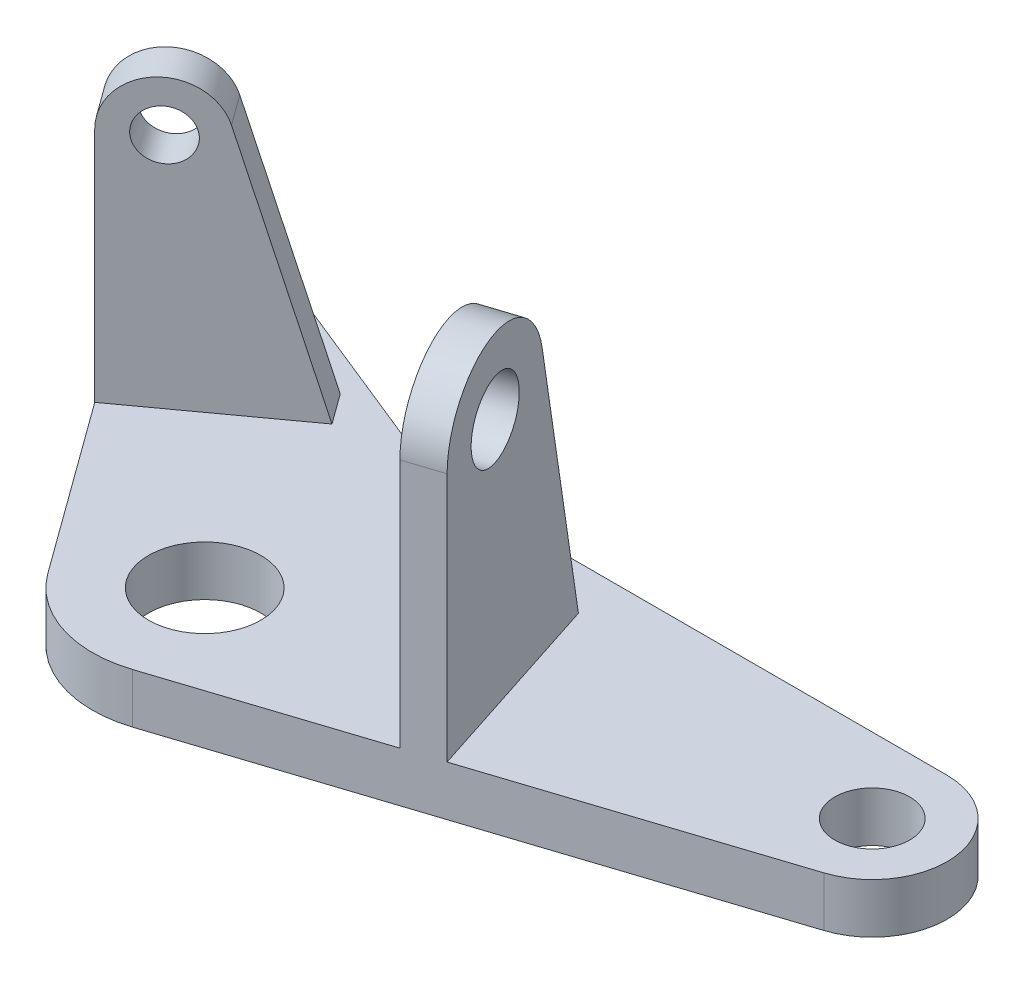
ISO-10303-21;
HEADER;
FILE_DESCRIPTION(('STEP AP214'),'2;1');
FILE_NAME('part.step','',(''),(''),'','','');
FILE_SCHEMA(('AUTOMOTIVE_DESIGN { 1 0 10303 214 1 1 1 1 }'));
ENDSEC;
DATA;
#1=APPLICATION_CONTEXT('core data for automotive mechanical design processes');
#2=APPLICATION_PROTOCOL_DEFINITION('international standard','automotive_design',2000,#1);
#3=PRODUCT_CONTEXT('',#1,'mechanical');
#4=PRODUCT('Part','Part','',(#3));
#5=PRODUCT_RELATED_PRODUCT_CATEGORY('part','',(#4));
#6=PRODUCT_DEFINITION_FORMATION('','',#4);
#7=PRODUCT_DEFINITION_CONTEXT('part definition',#1,'design');
#8=PRODUCT_DEFINITION('design','',#6,#7);
#9=PRODUCT_DEFINITION_SHAPE('','',#8);
#10=(LENGTH_UNIT() NAMED_UNIT(*) SI_UNIT(.MILLI.,.METRE.));
#11=(NAMED_UNIT(*) PLANE_ANGLE_UNIT() SI_UNIT($,.RADIAN.));
#12=(NAMED_UNIT(*) SI_UNIT($,.STERADIAN.) SOLID_ANGLE_UNIT());
#13=UNCERTAINTY_MEASURE_WITH_UNIT(LENGTH_MEASURE(1.E-05),#10,'distance_accuracy_value','');
#14=(GEOMETRIC_REPRESENTATION_CONTEXT(3) GLOBAL_UNCERTAINTY_ASSIGNED_CONTEXT((#13)) GLOBAL_UNIT_ASSIGNED_CONTEXT((#10,
#11,#12)) REPRESENTATION_CONTEXT('',''));
#15=CARTESIAN_POINT('',(0.,0.,0.));
#16=DIRECTION('',(0.,0.,1.));
#17=DIRECTION('',(1.,0.,0.));
#18=AXIS2_PLACEMENT_3D('',#15,#16,#17);
#19=CARTESIAN_POINT('',(82.,8.,12.));
#20=DIRECTION('',(0.,1.,0.));
#21=DIRECTION('',(0.,0.,1.));
#22=AXIS2_PLACEMENT_3D('',#19,#20,#21);
#23=PLANE('',#22);
#24=CARTESIAN_POINT('',(82.,8.,12.));
#25=DIRECTION('',(0.,1.,0.));
#26=DIRECTION('',(0.,0.,1.));
#27=AXIS2_PLACEMENT_3D('',#24,#25,#26);
#28=CIRCLE('',#27,6.);
#29=CARTESIAN_POINT('',(82.,8.,18.));
#30=VERTEX_POINT('',#29);
#31=EDGE_CURVE('E227',#30,#30,#28,.T.);
#32=ORIENTED_EDGE('',*,*,#31,.F.);
#33=EDGE_LOOP('',(#32));
#34=FACE_BOUND('',#33,.T.);
#35=CARTESIAN_POINT('',(-48.,8.,-10.7649808986669));
#36=DIRECTION('',(0.,1.,0.));
#37=DIRECTION('',(0.,0.,1.));
#38=AXIS2_PLACEMENT_3D('',#35,#36,#37);
#39=CIRCLE('',#38,4.00000000000001);
#40=CARTESIAN_POINT('',(-48.,8.,-6.76498089866689));
#41=VERTEX_POINT('',#40);
#42=EDGE_CURVE('E233',#41,#41,#39,.T.);
#43=ORIENTED_EDGE('',*,*,#42,.F.);
#44=EDGE_LOOP('',(#43));
#45=FACE_BOUND('',#44,.T.);
#46=CARTESIAN_POINT('',(-3.49949316028627,8.,33.4716960002775));
#47=DIRECTION('',(0.,1.,0.));
#48=DIRECTION('',(0.,0.,1.));
#49=AXIS2_PLACEMENT_3D('',#46,#47,#48);
#50=CIRCLE('',#49,9.);
#51=CARTESIAN_POINT('',(-3.49949316028627,8.,42.4716960002775));
#52=VERTEX_POINT('',#51);
#53=EDGE_CURVE('E221',#52,#52,#50,.T.);
#54=ORIENTED_EDGE('',*,*,#53,.F.);
#55=EDGE_LOOP('',(#54));
#56=FACE_BOUND('',#55,.T.);
#57=DIRECTION('',(-0.951056516295155,0.,0.309016994374942));
#58=VECTOR('',#57,1.);
#59=CARTESIAN_POINT('',(29.9784784506598,8.,7.06357898531494));
#60=LINE('',#59,#58);
#61=CARTESIAN_POINT('',(29.9784784506598,8.,7.06357898531494));
#62=VERTEX_POINT('',#61);
#63=CARTESIAN_POINT('',(24.2721393528889,8.,8.91768095156459));
#64=VERTEX_POINT('',#63);
#65=EDGE_CURVE('E58',#62,#64,#60,.T.);
#66=ORIENTED_EDGE('',*,*,#65,.F.);
#67=DIRECTION('',(-0.309016994374942,0.,-0.951056516295155));
#68=VECTOR('',#67,1.);
#69=CARTESIAN_POINT('',(40.1050733902689,8.,38.2300335185926));
#70=LINE('',#69,#68);
#71=CARTESIAN_POINT('',(40.1050733902689,8.,38.2300335185926));
#72=VERTEX_POINT('',#71);
#73=EDGE_CURVE('E157',#72,#62,#70,.T.);
#74=ORIENTED_EDGE('',*,*,#73,.F.);
#75=DIRECTION('',(0.951056516295155,0.,-0.309016994374942));
#76=VECTOR('',#75,1.);
#77=CARTESIAN_POINT('',(2.06281273846268,8.,50.5907132935903));
#78=LINE('',#77,#76);
#79=CARTESIAN_POINT('',(85.7082039324993,8.,23.4126781955419));
#80=VERTEX_POINT('',#79);
#81=EDGE_CURVE('E254',#72,#80,#78,.T.);
#82=ORIENTED_EDGE('',*,*,#81,.T.);
#83=CARTESIAN_POINT('',(82.,8.,12.));
#84=DIRECTION('',(0.,1.,0.));
#85=DIRECTION('',(0.,0.,1.));
#86=AXIS2_PLACEMENT_3D('',#83,#84,#85);
#87=CIRCLE('',#86,12.);
#88=CARTESIAN_POINT('',(82.,8.,0.));
#89=VERTEX_POINT('',#88);
#90=EDGE_CURVE('E239',#80,#89,#87,.T.);
#91=ORIENTED_EDGE('',*,*,#90,.T.);
#92=DIRECTION('',(-1.,0.,0.));
#93=VECTOR('',#92,1.);
#94=CARTESIAN_POINT('',(82.,8.,0.));
#95=LINE('',#94,#93);
#96=CARTESIAN_POINT('',(0.,8.,0.));
#97=VERTEX_POINT('',#96);
#98=EDGE_CURVE('E242',#89,#97,#95,.T.);
#99=ORIENTED_EDGE('',*,*,#98,.T.);
#100=DIRECTION('',(-0.927183854566787,0.,-0.374606593415913));
#101=VECTOR('',#100,1.);
#102=CARTESIAN_POINT('',(0.,8.,0.));
#103=LINE('',#102,#101);
#104=CARTESIAN_POINT('',(-45.0031472526727,8.,-18.1824517352012));
#105=VERTEX_POINT('',#104);
#106=EDGE_CURVE('E245',#97,#105,#103,.T.);
#107=ORIENTED_EDGE('',*,*,#106,.T.);
#108=CARTESIAN_POINT('',(-48.,8.,-10.7649808986669));
#109=DIRECTION('',(0.,1.,0.));
#110=DIRECTION('',(0.,0.,1.));
#111=AXIS2_PLACEMENT_3D('',#108,#109,#110);
#112=CIRCLE('',#111,8.);
#113=CARTESIAN_POINT('',(-54.4721359549996,8.,-6.06269888032708));
#114=VERTEX_POINT('',#113);
#115=EDGE_CURVE('E247',#105,#114,#112,.T.);
#116=ORIENTED_EDGE('',*,*,#115,.T.);
#117=DIRECTION('',(0.587785252292478,0.,0.809016994374944));
#118=VECTOR('',#117,1.);
#119=CARTESIAN_POINT('',(-54.4721359549996,8.,-6.06269888032708));
#120=LINE('',#119,#118);
#121=CARTESIAN_POINT('',(-41.5732091507344,8.,11.6911507665443));
#122=VERTEX_POINT('',#121);
#123=EDGE_CURVE('E250',#114,#122,#120,.T.);
#124=ORIENTED_EDGE('',*,*,#123,.T.);
#125=DIRECTION('',(0.809016994374944,0.,-0.587785252292478));
#126=VECTOR('',#125,1.);
#127=CARTESIAN_POINT('',(-19.5528019877054,8.,-4.30761152139028));
#128=LINE('',#127,#126);
#129=CARTESIAN_POINT('',(-19.5528019877054,8.,-4.30761152139028));
#130=VERTEX_POINT('',#129);
#131=EDGE_CURVE('E190',#122,#130,#128,.T.);
#132=ORIENTED_EDGE('',*,*,#131,.T.);
#133=DIRECTION('',(-0.587785252292478,0.,-0.809016994374944));
#134=VECTOR('',#133,1.);
#135=CARTESIAN_POINT('',(-16.0260904739505,8.,0.546490444859386));
#136=LINE('',#135,#134);
#137=CARTESIAN_POINT('',(-16.0260904739505,8.,0.546490444859386));
#138=VERTEX_POINT('',#137);
#139=EDGE_CURVE('E217',#138,#130,#136,.T.);
#140=ORIENTED_EDGE('',*,*,#139,.F.);
#141=DIRECTION('',(0.809016994374944,0.,-0.587785252292478));
#142=VECTOR('',#141,1.);
#143=CARTESIAN_POINT('',(-16.0260904739505,8.,0.546490444859386));
#144=LINE('',#143,#142);
#145=CARTESIAN_POINT('',(-38.0464976369795,8.,16.545252732794));
#146=VERTEX_POINT('',#145);
#147=EDGE_CURVE('E193',#146,#138,#144,.T.);
#148=ORIENTED_EDGE('',*,*,#147,.F.);
#149=CARTESIAN_POINT('',(-18.0617990590353,8.,44.0518305415421));
#150=VERTEX_POINT('',#149);
#151=EDGE_CURVE('E249',#146,#150,#120,.T.);
#152=ORIENTED_EDGE('',*,*,#151,.T.);
#153=CARTESIAN_POINT('',(-3.49949316028627,8.,33.4716960002775));
#154=DIRECTION('',(0.,1.,0.));
#155=DIRECTION('',(0.,0.,1.));
#156=AXIS2_PLACEMENT_3D('',#153,#154,#155);
#157=CIRCLE('',#156,18.);
#158=CARTESIAN_POINT('',(2.06281273846268,8.,50.5907132935903));
#159=VERTEX_POINT('',#158);
#160=EDGE_CURVE('E252',#150,#159,#157,.T.);
#161=ORIENTED_EDGE('',*,*,#160,.T.);
#162=CARTESIAN_POINT('',(34.3987342924979,8.,40.0841354848423));
#163=VERTEX_POINT('',#162);
#164=EDGE_CURVE('E255',#159,#163,#78,.T.);
#165=ORIENTED_EDGE('',*,*,#164,.T.);
#166=DIRECTION('',(-0.309016994374942,0.,-0.951056516295155));
#167=VECTOR('',#166,1.);
#168=CARTESIAN_POINT('',(34.398734292498,8.,40.0841354848423));
#169=LINE('',#168,#167);
#170=EDGE_CURVE('E63',#163,#64,#169,.T.);
#171=ORIENTED_EDGE('',*,*,#170,.T.);
#172=EDGE_LOOP('',(#66,#74,#82,#91,#99,#107,#116,#124,#132,#140,#148,#152,#161,#165,#171));
#173=FACE_BOUND('',#172,.T.);
#174=ADVANCED_FACE('F43',(#34,#45,#56,#173),#23,.T.);
#175=CARTESIAN_POINT('',(82.,0.,12.));
#176=DIRECTION('',(0.,1.,0.));
#177=DIRECTION('',(0.,0.,1.));
#178=AXIS2_PLACEMENT_3D('',#175,#176,#177);
#179=PLANE('',#178);
#180=CARTESIAN_POINT('',(82.,0.,12.));
#181=DIRECTION('',(0.,1.,0.));
#182=DIRECTION('',(0.,0.,1.));
#183=AXIS2_PLACEMENT_3D('',#180,#181,#182);
#184=CIRCLE('',#183,12.);
#185=CARTESIAN_POINT('',(85.7082039324993,0.,23.4126781955419));
#186=VERTEX_POINT('',#185);
#187=CARTESIAN_POINT('',(82.,0.,0.));
#188=VERTEX_POINT('',#187);
#189=EDGE_CURVE('E236',#186,#188,#184,.T.);
#190=ORIENTED_EDGE('',*,*,#189,.F.);
#191=DIRECTION('',(0.951056516295155,0.,-0.309016994374942));
#192=VECTOR('',#191,1.);
#193=CARTESIAN_POINT('',(2.06281273846268,0.,50.5907132935903));
#194=LINE('',#193,#192);
#195=CARTESIAN_POINT('',(2.06281273846268,0.,50.5907132935903));
#196=VERTEX_POINT('',#195);
#197=EDGE_CURVE('E243',#196,#186,#194,.T.);
#198=ORIENTED_EDGE('',*,*,#197,.F.);
#199=CARTESIAN_POINT('',(-3.49949316028627,0.,33.4716960002775));
#200=DIRECTION('',(0.,1.,0.));
#201=DIRECTION('',(0.,0.,1.));
#202=AXIS2_PLACEMENT_3D('',#199,#200,#201);
#203=CIRCLE('',#202,18.);
#204=CARTESIAN_POINT('',(-18.0617990590353,0.,44.0518305415421));
#205=VERTEX_POINT('',#204);
#206=EDGE_CURVE('E268',#205,#196,#203,.T.);
#207=ORIENTED_EDGE('',*,*,#206,.F.);
#208=DIRECTION('',(0.587785252292478,0.,0.809016994374944));
#209=VECTOR('',#208,1.);
#210=CARTESIAN_POINT('',(-54.4721359549996,0.,-6.06269888032708));
#211=LINE('',#210,#209);
#212=CARTESIAN_POINT('',(-54.4721359549996,0.,-6.06269888032708));
#213=VERTEX_POINT('',#212);
#214=EDGE_CURVE('E266',#213,#205,#211,.T.);
#215=ORIENTED_EDGE('',*,*,#214,.F.);
#216=CARTESIAN_POINT('',(-48.,0.,-10.7649808986669));
#217=DIRECTION('',(0.,1.,0.));
#218=DIRECTION('',(0.,0.,1.));
#219=AXIS2_PLACEMENT_3D('',#216,#217,#218);
#220=CIRCLE('',#219,8.);
#221=CARTESIAN_POINT('',(-45.0031472526727,0.,-18.1824517352012));
#222=VERTEX_POINT('',#221);
#223=EDGE_CURVE('E264',#222,#213,#220,.T.);
#224=ORIENTED_EDGE('',*,*,#223,.F.);
#225=DIRECTION('',(-0.927183854566787,0.,-0.374606593415913));
#226=VECTOR('',#225,1.);
#227=CARTESIAN_POINT('',(0.,0.,0.));
#228=LINE('',#227,#226);
#229=CARTESIAN_POINT('',(0.,0.,0.));
#230=VERTEX_POINT('',#229);
#231=EDGE_CURVE('E262',#230,#222,#228,.T.);
#232=ORIENTED_EDGE('',*,*,#231,.F.);
#233=DIRECTION('',(-1.,0.,0.));
#234=VECTOR('',#233,1.);
#235=CARTESIAN_POINT('',(82.,0.,0.));
#236=LINE('',#235,#234);
#237=EDGE_CURVE('E260',#188,#230,#236,.T.);
#238=ORIENTED_EDGE('',*,*,#237,.F.);
#239=EDGE_LOOP('',(#190,#198,#207,#215,#224,#232,#238));
#240=FACE_BOUND('',#239,.T.);
#241=CARTESIAN_POINT('',(-48.,0.,-10.7649808986669));
#242=DIRECTION('',(0.,1.,0.));
#243=DIRECTION('',(0.,0.,1.));
#244=AXIS2_PLACEMENT_3D('',#241,#242,#243);
#245=CIRCLE('',#244,4.00000000000001);
#246=CARTESIAN_POINT('',(-48.,0.,-6.76498089866689));
#247=VERTEX_POINT('',#246);
#248=EDGE_CURVE('E230',#247,#247,#245,.T.);
#249=ORIENTED_EDGE('',*,*,#248,.T.);
#250=EDGE_LOOP('',(#249));
#251=FACE_BOUND('',#250,.T.);
#252=CARTESIAN_POINT('',(82.,0.,12.));
#253=DIRECTION('',(0.,1.,0.));
#254=DIRECTION('',(0.,0.,1.));
#255=AXIS2_PLACEMENT_3D('',#252,#253,#254);
#256=CIRCLE('',#255,6.);
#257=CARTESIAN_POINT('',(82.,0.,18.));
#258=VERTEX_POINT('',#257);
#259=EDGE_CURVE('E224',#258,#258,#256,.T.);
#260=ORIENTED_EDGE('',*,*,#259,.T.);
#261=EDGE_LOOP('',(#260));
#262=FACE_BOUND('',#261,.T.);
#263=CARTESIAN_POINT('',(-3.49949316028627,0.,33.4716960002775));
#264=DIRECTION('',(0.,1.,0.));
#265=DIRECTION('',(0.,0.,1.));
#266=AXIS2_PLACEMENT_3D('',#263,#264,#265);
#267=CIRCLE('',#266,9.);
#268=CARTESIAN_POINT('',(-3.49949316028627,0.,42.4716960002775));
#269=VERTEX_POINT('',#268);
#270=EDGE_CURVE('E220',#269,#269,#267,.T.);
#271=ORIENTED_EDGE('',*,*,#270,.T.);
#272=EDGE_LOOP('',(#271));
#273=FACE_BOUND('',#272,.T.);
#274=ADVANCED_FACE('F295',(#240,#251,#262,#273),#179,.F.);
#275=CARTESIAN_POINT('',(82.,8.,12.));
#276=DIRECTION('',(0.,-1.,0.));
#277=DIRECTION('',(0.,0.,-1.));
#278=AXIS2_PLACEMENT_3D('',#275,#276,#277);
#279=CYLINDRICAL_SURFACE('',#278,12.);
#280=ORIENTED_EDGE('',*,*,#189,.T.);
#281=DIRECTION('',(0.,-1.,0.));
#282=VECTOR('',#281,1.);
#283=CARTESIAN_POINT('',(82.,8.,0.));
#284=LINE('',#283,#282);
#285=EDGE_CURVE('E11',#89,#188,#284,.T.);
#286=ORIENTED_EDGE('',*,*,#285,.F.);
#287=ORIENTED_EDGE('',*,*,#90,.F.);
#288=DIRECTION('',(0.,-1.,0.));
#289=VECTOR('',#288,1.);
#290=CARTESIAN_POINT('',(85.7082039324993,8.,23.4126781955419));
#291=LINE('',#290,#289);
#292=EDGE_CURVE('E257',#80,#186,#291,.T.);
#293=ORIENTED_EDGE('',*,*,#292,.T.);
#294=EDGE_LOOP('',(#280,#286,#287,#293));
#295=FACE_BOUND('',#294,.T.);
#296=ADVANCED_FACE('F45',(#295),#279,.T.);
#297=CARTESIAN_POINT('',(82.,8.,0.));
#298=DIRECTION('',(0.,0.,1.));
#299=DIRECTION('',(1.,0.,0.));
#300=AXIS2_PLACEMENT_3D('',#297,#298,#299);
#301=PLANE('',#300);
#302=ORIENTED_EDGE('',*,*,#237,.T.);
#303=DIRECTION('',(0.,-1.,0.));
#304=VECTOR('',#303,1.);
#305=CARTESIAN_POINT('',(0.,8.,0.));
#306=LINE('',#305,#304);
#307=EDGE_CURVE('E51',#97,#230,#306,.T.);
#308=ORIENTED_EDGE('',*,*,#307,.F.);
#309=ORIENTED_EDGE('',*,*,#98,.F.);
#310=ORIENTED_EDGE('',*,*,#285,.T.);
#311=EDGE_LOOP('',(#302,#308,#309,#310));
#312=FACE_BOUND('',#311,.T.);
#313=ADVANCED_FACE('F312',(#312),#301,.F.);
#314=CARTESIAN_POINT('',(0.,8.,0.));
#315=DIRECTION('',(-0.374606593415913,0.,0.927183854566787));
#316=DIRECTION('',(0.927183854566787,0.,0.374606593415913));
#317=AXIS2_PLACEMENT_3D('',#314,#315,#316);
#318=PLANE('',#317);
#319=ORIENTED_EDGE('',*,*,#231,.T.);
#320=DIRECTION('',(0.,-1.,0.));
#321=VECTOR('',#320,1.);
#322=CARTESIAN_POINT('',(-45.0031472526727,8.,-18.1824517352012));
#323=LINE('',#322,#321);
#324=EDGE_CURVE('E282',#105,#222,#323,.T.);
#325=ORIENTED_EDGE('',*,*,#324,.F.);
#326=ORIENTED_EDGE('',*,*,#106,.F.);
#327=ORIENTED_EDGE('',*,*,#307,.T.);
#328=EDGE_LOOP('',(#319,#325,#326,#327));
#329=FACE_BOUND('',#328,.T.);
#330=ADVANCED_FACE('F289',(#329),#318,.F.);
#331=CARTESIAN_POINT('',(-48.,8.,-10.7649808986669));
#332=DIRECTION('',(0.,-1.,0.));
#333=DIRECTION('',(0.,0.,-1.));
#334=AXIS2_PLACEMENT_3D('',#331,#332,#333);
#335=CYLINDRICAL_SURFACE('',#334,8.);
#336=ORIENTED_EDGE('',*,*,#223,.T.);
#337=DIRECTION('',(0.,-1.,0.));
#338=VECTOR('',#337,1.);
#339=CARTESIAN_POINT('',(-54.4721359549996,8.,-6.06269888032708));
#340=LINE('',#339,#338);
#341=EDGE_CURVE('E279',#114,#213,#340,.T.);
#342=ORIENTED_EDGE('',*,*,#341,.F.);
#343=ORIENTED_EDGE('',*,*,#115,.F.);
#344=ORIENTED_EDGE('',*,*,#324,.T.);
#345=EDGE_LOOP('',(#336,#342,#343,#344));
#346=FACE_BOUND('',#345,.T.);
#347=ADVANCED_FACE('F301',(#346),#335,.T.);
#348=CARTESIAN_POINT('',(-54.4721359549996,8.,-6.06269888032708));
#349=DIRECTION('',(0.809016994374944,0.,-0.587785252292478));
#350=DIRECTION('',(-0.587785252292478,0.,-0.809016994374944));
#351=AXIS2_PLACEMENT_3D('',#348,#349,#350);
#352=PLANE('',#351);
#353=ORIENTED_EDGE('',*,*,#214,.T.);
#354=DIRECTION('',(0.,-1.,0.));
#355=VECTOR('',#354,1.);
#356=CARTESIAN_POINT('',(-18.0617990590353,8.,44.0518305415421));
#357=LINE('',#356,#355);
#358=EDGE_CURVE('E276',#150,#205,#357,.T.);
#359=ORIENTED_EDGE('',*,*,#358,.F.);
#360=ORIENTED_EDGE('',*,*,#151,.F.);
#361=DIRECTION('',(0.,-1.,0.));
#362=VECTOR('',#361,1.);
#363=CARTESIAN_POINT('',(-38.0464976369795,8.,16.545252732794));
#364=LINE('',#363,#362);
#365=CARTESIAN_POINT('',(-38.0464976369795,46.,16.545252732794));
#366=VERTEX_POINT('',#365);
#367=EDGE_CURVE('E201',#366,#146,#364,.T.);
#368=ORIENTED_EDGE('',*,*,#367,.F.);
#369=DIRECTION('',(-0.587785252292478,0.,-0.809016994374944));
#370=VECTOR('',#369,1.);
#371=CARTESIAN_POINT('',(-38.0464976369795,46.,16.545252732794));
#372=LINE('',#371,#370);
#373=CARTESIAN_POINT('',(-41.5732091507344,46.,11.6911507665444));
#374=VERTEX_POINT('',#373);
#375=EDGE_CURVE('E204',#366,#374,#372,.T.);
#376=ORIENTED_EDGE('',*,*,#375,.T.);
#377=DIRECTION('',(0.,-1.,0.));
#378=VECTOR('',#377,1.);
#379=CARTESIAN_POINT('',(-41.5732091507344,8.,11.6911507665444));
#380=LINE('',#379,#378);
#381=EDGE_CURVE('E197',#374,#122,#380,.T.);
#382=ORIENTED_EDGE('',*,*,#381,.T.);
#383=ORIENTED_EDGE('',*,*,#123,.F.);
#384=ORIENTED_EDGE('',*,*,#341,.T.);
#385=EDGE_LOOP('',(#353,#359,#360,#368,#376,#382,#383,#384));
#386=FACE_BOUND('',#385,.T.);
#387=ADVANCED_FACE('F305',(#386),#352,.F.);
#388=CARTESIAN_POINT('',(-3.49949316028627,8.,33.4716960002775));
#389=DIRECTION('',(0.,-1.,0.));
#390=DIRECTION('',(0.,0.,-1.));
#391=AXIS2_PLACEMENT_3D('',#388,#389,#390);
#392=CYLINDRICAL_SURFACE('',#391,18.);
#393=ORIENTED_EDGE('',*,*,#206,.T.);
#394=DIRECTION('',(0.,-1.,0.));
#395=VECTOR('',#394,1.);
#396=CARTESIAN_POINT('',(2.06281273846268,8.,50.5907132935903));
#397=LINE('',#396,#395);
#398=EDGE_CURVE('E273',#159,#196,#397,.T.);
#399=ORIENTED_EDGE('',*,*,#398,.F.);
#400=ORIENTED_EDGE('',*,*,#160,.F.);
#401=ORIENTED_EDGE('',*,*,#358,.T.);
#402=EDGE_LOOP('',(#393,#399,#400,#401));
#403=FACE_BOUND('',#402,.T.);
#404=ADVANCED_FACE('F322',(#403),#392,.T.);
#405=CARTESIAN_POINT('',(2.06281273846268,8.,50.5907132935903));
#406=DIRECTION('',(-0.309016994374942,0.,-0.951056516295155));
#407=DIRECTION('',(-0.951056516295155,0.,0.309016994374942));
#408=AXIS2_PLACEMENT_3D('',#405,#406,#407);
#409=PLANE('',#408);
#410=ORIENTED_EDGE('',*,*,#197,.T.);
#411=ORIENTED_EDGE('',*,*,#292,.F.);
#412=ORIENTED_EDGE('',*,*,#81,.F.);
#413=DIRECTION('',(0.,-1.,0.));
#414=VECTOR('',#413,1.);
#415=CARTESIAN_POINT('',(40.1050733902689,8.,38.2300335185926));
#416=LINE('',#415,#414);
#417=CARTESIAN_POINT('',(40.1050733902689,48.,38.2300335185926));
#418=VERTEX_POINT('',#417);
#419=EDGE_CURVE('E171',#418,#72,#416,.T.);
#420=ORIENTED_EDGE('',*,*,#419,.F.);
#421=DIRECTION('',(-0.951056516295155,0.,0.309016994374942));
#422=VECTOR('',#421,1.);
#423=CARTESIAN_POINT('',(40.1050733902689,48.,38.2300335185926));
#424=LINE('',#423,#422);
#425=CARTESIAN_POINT('',(34.398734292498,48.,40.0841354848423));
#426=VERTEX_POINT('',#425);
#427=EDGE_CURVE('E166',#418,#426,#424,.T.);
#428=ORIENTED_EDGE('',*,*,#427,.T.);
#429=DIRECTION('',(0.,-1.,0.));
#430=VECTOR('',#429,1.);
#431=CARTESIAN_POINT('',(34.398734292498,8.,40.0841354848423));
#432=LINE('',#431,#430);
#433=EDGE_CURVE('E181',#426,#163,#432,.T.);
#434=ORIENTED_EDGE('',*,*,#433,.T.);
#435=ORIENTED_EDGE('',*,*,#164,.F.);
#436=ORIENTED_EDGE('',*,*,#398,.T.);
#437=EDGE_LOOP('',(#410,#411,#412,#420,#428,#434,#435,#436));
#438=FACE_BOUND('',#437,.T.);
#439=ADVANCED_FACE('F317',(#438),#409,.F.);
#440=CARTESIAN_POINT('',(-48.,8.,-10.7649808986669));
#441=DIRECTION('',(0.,-1.,0.));
#442=DIRECTION('',(0.,0.,-1.));
#443=AXIS2_PLACEMENT_3D('',#440,#441,#442);
#444=CYLINDRICAL_SURFACE('',#443,4.00000000000001);
#445=ORIENTED_EDGE('',*,*,#42,.T.);
#446=EDGE_LOOP('',(#445));
#447=FACE_BOUND('',#446,.T.);
#448=ORIENTED_EDGE('',*,*,#248,.F.);
#449=EDGE_LOOP('',(#448));
#450=FACE_BOUND('',#449,.T.);
#451=ADVANCED_FACE('F362',(#447,#450),#444,.F.);
#452=CARTESIAN_POINT('',(82.,8.,12.));
#453=DIRECTION('',(0.,-1.,0.));
#454=DIRECTION('',(0.,0.,-1.));
#455=AXIS2_PLACEMENT_3D('',#452,#453,#454);
#456=CYLINDRICAL_SURFACE('',#455,6.);
#457=ORIENTED_EDGE('',*,*,#31,.T.);
#458=EDGE_LOOP('',(#457));
#459=FACE_BOUND('',#458,.T.);
#460=ORIENTED_EDGE('',*,*,#259,.F.);
#461=EDGE_LOOP('',(#460));
#462=FACE_BOUND('',#461,.T.);
#463=ADVANCED_FACE('F425',(#459,#462),#456,.F.);
#464=CARTESIAN_POINT('',(-3.49949316028627,8.,33.4716960002775));
#465=DIRECTION('',(0.,-1.,0.));
#466=DIRECTION('',(0.,0.,-1.));
#467=AXIS2_PLACEMENT_3D('',#464,#465,#466);
#468=CYLINDRICAL_SURFACE('',#467,9.);
#469=ORIENTED_EDGE('',*,*,#53,.T.);
#470=EDGE_LOOP('',(#469));
#471=FACE_BOUND('',#470,.T.);
#472=ORIENTED_EDGE('',*,*,#270,.F.);
#473=EDGE_LOOP('',(#472));
#474=FACE_BOUND('',#473,.T.);
#475=ADVANCED_FACE('F433',(#471,#474),#468,.F.);
#476=CARTESIAN_POINT('',(-31.57436168198,46.,11.8429707144542));
#477=DIRECTION('',(0.587785252292478,0.,0.809016994374944));
#478=DIRECTION('',(0.809016994374944,0.,-0.587785252292478));
#479=AXIS2_PLACEMENT_3D('',#476,#477,#478);
#480=PLANE('',#479);
#481=ORIENTED_EDGE('',*,*,#147,.T.);
#482=DIRECTION('',(-0.222995305140521,0.961261695938321,0.162015572730123));
#483=VECTOR('',#482,1.);
#484=CARTESIAN_POINT('',(-25.3529452975337,48.2050988465359,7.32284712672458));
#485=LINE('',#484,#483);
#486=CARTESIAN_POINT('',(-25.3529452975337,48.2050988465359,7.32284712672459));
#487=VERTEX_POINT('',#486);
#488=EDGE_CURVE('E196',#138,#487,#485,.T.);
#489=ORIENTED_EDGE('',*,*,#488,.T.);
#490=CARTESIAN_POINT('',(-31.57436168198,46.,11.8429707144542));
#491=DIRECTION('',(0.587785252292478,0.,0.809016994374944));
#492=DIRECTION('',(0.809016994374944,0.,-0.587785252292478));
#493=AXIS2_PLACEMENT_3D('',#490,#491,#492);
#494=CIRCLE('',#493,8.);
#495=EDGE_CURVE('E199',#487,#366,#494,.T.);
#496=ORIENTED_EDGE('',*,*,#495,.T.);
#497=ORIENTED_EDGE('',*,*,#367,.T.);
#498=EDGE_LOOP('',(#481,#489,#496,#497));
#499=FACE_BOUND('',#498,.T.);
#500=CARTESIAN_POINT('',(-31.57436168198,46.,11.8429707144542));
#501=DIRECTION('',(0.587785252292478,0.,0.809016994374944));
#502=DIRECTION('',(0.809016994374944,0.,-0.587785252292478));
#503=AXIS2_PLACEMENT_3D('',#500,#501,#502);
#504=CIRCLE('',#503,4.);
#505=CARTESIAN_POINT('',(-34.8104296594797,46.,14.1941117236241));
#506=VERTEX_POINT('',#505);
#507=EDGE_CURVE('E187',#506,#506,#504,.T.);
#508=ORIENTED_EDGE('',*,*,#507,.F.);
#509=EDGE_LOOP('',(#508));
#510=FACE_BOUND('',#509,.T.);
#511=ADVANCED_FACE('F326',(#499,#510),#480,.T.);
#512=CARTESIAN_POINT('',(-35.1010731957348,46.,6.98886874820453));
#513=DIRECTION('',(0.587785252292478,0.,0.809016994374944));
#514=DIRECTION('',(0.809016994374944,0.,-0.587785252292478));
#515=AXIS2_PLACEMENT_3D('',#512,#513,#514);
#516=PLANE('',#515);
#517=ORIENTED_EDGE('',*,*,#131,.F.);
#518=ORIENTED_EDGE('',*,*,#381,.F.);
#519=CARTESIAN_POINT('',(-35.1010731957348,46.,6.98886874820453));
#520=DIRECTION('',(0.587785252292478,0.,0.809016994374944));
#521=DIRECTION('',(0.809016994374944,0.,-0.587785252292478));
#522=AXIS2_PLACEMENT_3D('',#519,#520,#521);
#523=CIRCLE('',#522,8.);
#524=CARTESIAN_POINT('',(-28.8796568112886,48.2050988465359,2.46874516047492));
#525=VERTEX_POINT('',#524);
#526=EDGE_CURVE('E208',#525,#374,#523,.T.);
#527=ORIENTED_EDGE('',*,*,#526,.F.);
#528=DIRECTION('',(-0.222995305140521,0.961261695938321,0.162015572730123));
#529=VECTOR('',#528,1.);
#530=CARTESIAN_POINT('',(-28.8796568112886,48.2050988465359,2.46874516047492));
#531=LINE('',#530,#529);
#532=EDGE_CURVE('E206',#130,#525,#531,.T.);
#533=ORIENTED_EDGE('',*,*,#532,.F.);
#534=EDGE_LOOP('',(#517,#518,#527,#533));
#535=FACE_BOUND('',#534,.T.);
#536=CARTESIAN_POINT('',(-35.1010731957348,46.,6.98886874820453));
#537=DIRECTION('',(0.587785252292478,0.,0.809016994374944));
#538=DIRECTION('',(0.809016994374944,0.,-0.587785252292478));
#539=AXIS2_PLACEMENT_3D('',#536,#537,#538);
#540=CIRCLE('',#539,4.);
#541=CARTESIAN_POINT('',(-38.3371411732346,46.,9.34000975737444));
#542=VERTEX_POINT('',#541);
#543=EDGE_CURVE('E186',#542,#542,#540,.T.);
#544=ORIENTED_EDGE('',*,*,#543,.T.);
#545=EDGE_LOOP('',(#544));
#546=FACE_BOUND('',#545,.T.);
#547=ADVANCED_FACE('F336',(#535,#546),#516,.F.);
#548=CARTESIAN_POINT('',(-25.3529452975337,48.2050988465359,7.32284712672458));
#549=DIRECTION('',(-0.777677048055781,-0.275637355816993,0.565015448466201));
#550=DIRECTION('',(0.587785252292478,0.,0.809016994374944));
#551=AXIS2_PLACEMENT_3D('',#548,#549,#550);
#552=PLANE('',#551);
#553=ORIENTED_EDGE('',*,*,#532,.T.);
#554=DIRECTION('',(-0.587785252292478,0.,-0.809016994374944));
#555=VECTOR('',#554,1.);
#556=CARTESIAN_POINT('',(-25.3529452975337,48.2050988465359,7.32284712672459));
#557=LINE('',#556,#555);
#558=EDGE_CURVE('E214',#487,#525,#557,.T.);
#559=ORIENTED_EDGE('',*,*,#558,.F.);
#560=ORIENTED_EDGE('',*,*,#488,.F.);
#561=ORIENTED_EDGE('',*,*,#139,.T.);
#562=EDGE_LOOP('',(#553,#559,#560,#561));
#563=FACE_BOUND('',#562,.T.);
#564=ADVANCED_FACE('F339',(#563),#552,.F.);
#565=CARTESIAN_POINT('',(-31.57436168198,46.,11.8429707144542));
#566=DIRECTION('',(-0.587785252292478,0.,-0.809016994374944));
#567=DIRECTION('',(-0.809016994374944,0.,0.587785252292478));
#568=AXIS2_PLACEMENT_3D('',#565,#566,#567);
#569=CYLINDRICAL_SURFACE('',#568,8.);
#570=ORIENTED_EDGE('',*,*,#526,.T.);
#571=ORIENTED_EDGE('',*,*,#375,.F.);
#572=ORIENTED_EDGE('',*,*,#495,.F.);
#573=ORIENTED_EDGE('',*,*,#558,.T.);
#574=EDGE_LOOP('',(#570,#571,#572,#573));
#575=FACE_BOUND('',#574,.T.);
#576=ADVANCED_FACE('F333',(#575),#569,.T.);
#577=CARTESIAN_POINT('',(-31.57436168198,46.,11.8429707144542));
#578=DIRECTION('',(-0.587785252292478,0.,-0.809016994374944));
#579=DIRECTION('',(-0.809016994374944,0.,0.587785252292478));
#580=AXIS2_PLACEMENT_3D('',#577,#578,#579);
#581=CYLINDRICAL_SURFACE('',#580,4.);
#582=CARTESIAN_POINT('',(-34.8104296594797,46.,14.1941117236241));
#583=CARTESIAN_POINT('',(-34.847166237748,46.,14.1435481614757));
#584=CARTESIAN_POINT('',(-34.8839028160163,46.,14.0929845993272));
#585=CARTESIAN_POINT('',(-34.9573759725528,46.,13.9918574750304));
#586=CARTESIAN_POINT('',(-34.9941125508211,46.,13.9412939128819));
#587=CARTESIAN_POINT('',(-35.0675857073577,46.,13.8401667885851));
#588=CARTESIAN_POINT('',(-35.104322285626,46.,13.7896032264366));
#589=CARTESIAN_POINT('',(-35.1777954421625,46.,13.6884761021398));
#590=CARTESIAN_POINT('',(-35.2145320204308,46.,13.6379125399913));
#591=CARTESIAN_POINT('',(-35.2880051769674,46.,13.5367854156945));
#592=CARTESIAN_POINT('',(-35.3247417552356,46.,13.486221853546));
#593=CARTESIAN_POINT('',(-35.3982149117722,46.,13.3850947292492));
#594=CARTESIAN_POINT('',(-35.4349514900405,46.,13.3345311671007));
#595=CARTESIAN_POINT('',(-35.5084246465771,46.,13.2334040428039));
#596=CARTESIAN_POINT('',(-35.5451612248453,46.,13.1828404806554));
#597=CARTESIAN_POINT('',(-35.6186343813819,46.,13.0817133563586));
#598=CARTESIAN_POINT('',(-35.6553709596502,46.,13.0311497942101));
#599=CARTESIAN_POINT('',(-35.7288441161867,46.,12.9300226699133));
#600=CARTESIAN_POINT('',(-35.765580694455,46.,12.8794591077648));
#601=CARTESIAN_POINT('',(-35.8390538509916,46.,12.778331983468));
#602=CARTESIAN_POINT('',(-35.8757904292599,46.,12.7277684213195));
#603=CARTESIAN_POINT('',(-35.9492635857964,46.,12.6266412970227));
#604=CARTESIAN_POINT('',(-35.9860001640647,46.,12.5760777348742));
#605=CARTESIAN_POINT('',(-36.0594733206012,46.,12.4749506105774));
#606=CARTESIAN_POINT('',(-36.0962098988695,46.,12.4243870484289));
#607=CARTESIAN_POINT('',(-36.1696830554061,46.,12.3232599241321));
#608=CARTESIAN_POINT('',(-36.2064196336744,46.,12.2726963619836));
#609=CARTESIAN_POINT('',(-36.2798927902109,46.,12.1715692376867));
#610=CARTESIAN_POINT('',(-36.3166293684792,46.,12.1210056755383));
#611=CARTESIAN_POINT('',(-36.3901025250158,46.,12.0198785512414));
#612=CARTESIAN_POINT('',(-36.426839103284,46.,11.969314989093));
#613=CARTESIAN_POINT('',(-36.5003122598206,46.,11.8681878647961));
#614=CARTESIAN_POINT('',(-36.5370488380889,46.,11.8176243026477));
#615=CARTESIAN_POINT('',(-36.6105219946254,46.,11.7164971783508));
#616=CARTESIAN_POINT('',(-36.6472585728937,46.,11.6659336162024));
#617=CARTESIAN_POINT('',(-36.7207317294303,46.,11.5648064919055));
#618=CARTESIAN_POINT('',(-36.7574683076986,46.,11.5142429297571));
#619=CARTESIAN_POINT('',(-36.8309414642351,46.,11.4131158054602));
#620=CARTESIAN_POINT('',(-36.8676780425034,46.,11.3625522433118));
#621=CARTESIAN_POINT('',(-36.94115119904,46.,11.2614251190149));
#622=CARTESIAN_POINT('',(-36.9778877773082,46.,11.2108615568665));
#623=CARTESIAN_POINT('',(-37.0513609338448,46.,11.1097344325696));
#624=CARTESIAN_POINT('',(-37.0880975121131,46.,11.0591708704212));
#625=CARTESIAN_POINT('',(-37.1615706686496,46.,10.9580437461243));
#626=CARTESIAN_POINT('',(-37.1983072469179,46.,10.9074801839759));
#627=CARTESIAN_POINT('',(-37.2717804034545,46.,10.806353059679));
#628=CARTESIAN_POINT('',(-37.3085169817228,46.,10.7557894975306));
#629=CARTESIAN_POINT('',(-37.3819901382593,46.,10.6546623732337));
#630=CARTESIAN_POINT('',(-37.4187267165276,46.,10.6040988110853));
#631=CARTESIAN_POINT('',(-37.4921998730642,46.,10.5029716867884));
#632=CARTESIAN_POINT('',(-37.5289364513324,46.,10.45240812464));
#633=CARTESIAN_POINT('',(-37.602409607869,46.,10.3512810003431));
#634=CARTESIAN_POINT('',(-37.6391461861373,46.,10.3007174381947));
#635=CARTESIAN_POINT('',(-37.7126193426738,46.,10.1995903138978));
#636=CARTESIAN_POINT('',(-37.7493559209421,46.,10.1490267517494));
#637=CARTESIAN_POINT('',(-37.8228290774787,46.,10.0478996274525));
#638=CARTESIAN_POINT('',(-37.859565655747,46.,9.99733606530409));
#639=CARTESIAN_POINT('',(-37.9330388122835,46.,9.89620894100722));
#640=CARTESIAN_POINT('',(-37.9697753905518,46.,9.84564537885879));
#641=CARTESIAN_POINT('',(-38.0432485470884,46.,9.74451825456192));
#642=CARTESIAN_POINT('',(-38.0799851253566,46.,9.69395469241348));
#643=CARTESIAN_POINT('',(-38.1534582818932,46.,9.59282756811662));
#644=CARTESIAN_POINT('',(-38.1901948601615,46.,9.54226400596818));
#645=CARTESIAN_POINT('',(-38.263668016698,46.,9.44113688167131));
#646=CARTESIAN_POINT('',(-38.3004045949663,46.,9.39057331952288));
#647=CARTESIAN_POINT('',(-38.3371411732346,46.,9.34000975737444));
#648=B_SPLINE_CURVE_WITH_KNOTS('',3,(#582,#583,#584,#585,#586,#587,#588,#589,#590,#591,#592,
#593,#594,#595,#596,#597,#598,#599,#600,#601,#602,#603,#604,#605,#606,#607,#608,#609,#610,#611,
#612,#613,#614,#615,#616,#617,#618,#619,#620,#621,#622,#623,#624,#625,#626,#627,#628,#629,#630,
#631,#632,#633,#634,#635,#636,#637,#638,#639,#640,#641,#642,#643,#644,#645,#646,#647),
.UNSPECIFIED.,.F.,.F.,(4,2,2,2,2,2,2,2,2,2,2,2,2,2,2,2,2,2,2,2,2,2,2,2,2,2,2,2,2,2,2,2,4),(0.,
0.187500000000001,0.374999999999999,0.562499999999999,0.750000000000002,0.937499999999998,1.125,
1.3125,1.5,1.6875,1.875,2.0625,2.25,2.4375,2.625,2.8125,3.,3.1875,3.375,3.5625,3.75,3.9375,
4.125,4.3125,4.5,4.6875,4.875,5.0625,5.25,5.4375,5.625,5.8125,6.),.UNSPECIFIED.);
#649=EDGE_CURVE('BSEAM346',#506,#542,#648,.T.);
#650=ORIENTED_EDGE('',*,*,#507,.T.);
#651=ORIENTED_EDGE('',*,*,#543,.F.);
#652=ORIENTED_EDGE('',*,*,#649,.T.);
#653=ORIENTED_EDGE('',*,*,#649,.F.);
#654=EDGE_LOOP('',(#650,#652,#651,#653));
#655=FACE_BOUND('',#654,.T.);
#656=ADVANCED_FACE('F346',(#655),#581,.F.);
#657=CARTESIAN_POINT('',(36.3968694577696,48.,26.8173553230508));
#658=DIRECTION('',(-0.951056516295155,0.,0.309016994374942));
#659=DIRECTION('',(0.309016994374942,0.,0.951056516295155));
#660=AXIS2_PLACEMENT_3D('',#657,#658,#659);
#661=PLANE('',#660);
#662=ORIENTED_EDGE('',*,*,#73,.T.);
#663=DIRECTION('',(0.0642482457919142,0.978147600733807,0.197735768366167));
#664=VECTOR('',#663,1.);
#665=CARTESIAN_POINT('',(32.7696986781638,50.494940289813,15.6540715281345));
#666=LINE('',#665,#664);
#667=CARTESIAN_POINT('',(32.7696986781638,50.494940289813,15.6540715281345));
#668=VERTEX_POINT('',#667);
#669=EDGE_CURVE('E149',#62,#668,#666,.T.);
#670=ORIENTED_EDGE('',*,*,#669,.T.);
#671=CARTESIAN_POINT('',(36.3968694577696,48.,26.8173553230508));
#672=DIRECTION('',(0.951056516295155,0.,-0.309016994374942));
#673=DIRECTION('',(0.309016994374942,0.,0.951056516295155));
#674=AXIS2_PLACEMENT_3D('',#671,#672,#673);
#675=CIRCLE('',#674,12.);
#676=EDGE_CURVE('E155',#668,#418,#675,.T.);
#677=ORIENTED_EDGE('',*,*,#676,.T.);
#678=ORIENTED_EDGE('',*,*,#419,.T.);
#679=EDGE_LOOP('',(#662,#670,#677,#678));
#680=FACE_BOUND('',#679,.T.);
#681=CARTESIAN_POINT('',(36.3968694577696,48.,26.8173553230508));
#682=DIRECTION('',(0.951056516295155,0.,-0.309016994374942));
#683=DIRECTION('',(-0.309016994374942,0.,-0.951056516295155));
#684=AXIS2_PLACEMENT_3D('',#681,#682,#683);
#685=CIRCLE('',#684,6.);
#686=CARTESIAN_POINT('',(34.54276749152,48.,21.1110162252798));
#687=VERTEX_POINT('',#686);
#688=EDGE_CURVE('E177',#687,#687,#685,.T.);
#689=ORIENTED_EDGE('',*,*,#688,.F.);
#690=EDGE_LOOP('',(#689));
#691=FACE_BOUND('',#690,.T.);
#692=ADVANCED_FACE('F151',(#680,#691),#661,.F.);
#693=CARTESIAN_POINT('',(30.6905303599987,48.,28.6714572893004));
#694=DIRECTION('',(-0.951056516295155,0.,0.309016994374942));
#695=DIRECTION('',(0.309016994374942,0.,0.951056516295155));
#696=AXIS2_PLACEMENT_3D('',#693,#694,#695);
#697=PLANE('',#696);
#698=ORIENTED_EDGE('',*,*,#170,.F.);
#699=ORIENTED_EDGE('',*,*,#433,.F.);
#700=CARTESIAN_POINT('',(30.6905303599987,48.,28.6714572893004));
#701=DIRECTION('',(0.951056516295155,0.,-0.309016994374942));
#702=DIRECTION('',(0.309016994374942,0.,0.951056516295155));
#703=AXIS2_PLACEMENT_3D('',#700,#701,#702);
#704=CIRCLE('',#703,12.);
#705=CARTESIAN_POINT('',(27.0633595803928,50.494940289813,17.5081734943841));
#706=VERTEX_POINT('',#705);
#707=EDGE_CURVE('E179',#706,#426,#704,.T.);
#708=ORIENTED_EDGE('',*,*,#707,.F.);
#709=DIRECTION('',(0.0642482457919142,0.978147600733807,0.197735768366167));
#710=VECTOR('',#709,1.);
#711=CARTESIAN_POINT('',(27.0633595803928,50.494940289813,17.5081734943841));
#712=LINE('',#711,#710);
#713=EDGE_CURVE('E163',#64,#706,#712,.T.);
#714=ORIENTED_EDGE('',*,*,#713,.F.);
#715=EDGE_LOOP('',(#698,#699,#708,#714));
#716=FACE_BOUND('',#715,.T.);
#717=CARTESIAN_POINT('',(30.6905303599987,48.,28.6714572893004));
#718=DIRECTION('',(0.951056516295155,0.,-0.309016994374942));
#719=DIRECTION('',(-0.309016994374942,0.,-0.951056516295155));
#720=AXIS2_PLACEMENT_3D('',#717,#718,#719);
#721=CIRCLE('',#720,6.);
#722=CARTESIAN_POINT('',(28.836428393749,48.,22.9651181915295));
#723=VERTEX_POINT('',#722);
#724=EDGE_CURVE('E527',#723,#723,#721,.T.);
#725=ORIENTED_EDGE('',*,*,#724,.T.);
#726=EDGE_LOOP('',(#725));
#727=FACE_BOUND('',#726,.T.);
#728=ADVANCED_FACE('F480',(#716,#727),#697,.T.);
#729=CARTESIAN_POINT('',(32.7696986781638,50.494940289813,15.6540715281345));
#730=DIRECTION('',(0.302264231633822,-0.207911690817753,0.930273649576359));
#731=DIRECTION('',(0.951056516295155,0.,-0.309016994374942));
#732=AXIS2_PLACEMENT_3D('',#729,#730,#731);
#733=PLANE('',#732);
#734=ORIENTED_EDGE('',*,*,#713,.T.);
#735=DIRECTION('',(-0.951056516295155,0.,0.309016994374942));
#736=VECTOR('',#735,1.);
#737=CARTESIAN_POINT('',(32.7696986781638,50.494940289813,15.6540715281345));
#738=LINE('',#737,#736);
#739=EDGE_CURVE('E161',#668,#706,#738,.T.);
#740=ORIENTED_EDGE('',*,*,#739,.F.);
#741=ORIENTED_EDGE('',*,*,#669,.F.);
#742=ORIENTED_EDGE('',*,*,#65,.T.);
#743=EDGE_LOOP('',(#734,#740,#741,#742));
#744=FACE_BOUND('',#743,.T.);
#745=ADVANCED_FACE('F162',(#744),#733,.F.);
#746=CARTESIAN_POINT('',(36.3968694577696,48.,26.8173553230508));
#747=DIRECTION('',(-0.951056516295155,0.,0.309016994374942));
#748=DIRECTION('',(0.309016994374942,0.,0.951056516295155));
#749=AXIS2_PLACEMENT_3D('',#746,#747,#748);
#750=CYLINDRICAL_SURFACE('',#749,12.);
#751=ORIENTED_EDGE('',*,*,#707,.T.);
#752=ORIENTED_EDGE('',*,*,#427,.F.);
#753=ORIENTED_EDGE('',*,*,#676,.F.);
#754=ORIENTED_EDGE('',*,*,#739,.T.);
#755=EDGE_LOOP('',(#751,#752,#753,#754));
#756=FACE_BOUND('',#755,.T.);
#757=ADVANCED_FACE('F168',(#756),#750,.T.);
#758=CARTESIAN_POINT('',(36.3968694577696,48.,26.8173553230508));
#759=DIRECTION('',(-0.951056516295155,0.,0.309016994374942));
#760=DIRECTION('',(0.309016994374942,0.,0.951056516295155));
#761=AXIS2_PLACEMENT_3D('',#758,#759,#760);
#762=CYLINDRICAL_SURFACE('',#761,6.);
#763=ORIENTED_EDGE('',*,*,#688,.T.);
#764=EDGE_LOOP('',(#763));
#765=FACE_BOUND('',#764,.T.);
#766=ORIENTED_EDGE('',*,*,#724,.F.);
#767=EDGE_LOOP('',(#766));
#768=FACE_BOUND('',#767,.T.);
#769=ADVANCED_FACE('F503',(#765,#768),#762,.F.);
#770=CLOSED_SHELL('',(#174,#274,#296,#313,#330,#347,#387,#404,#439,#451,#463,#475,#511,#547,
#564,#576,#656,#692,#728,#745,#757,#769));
#771=MANIFOLD_SOLID_BREP('B2',#770);
#772=ADVANCED_BREP_SHAPE_REPRESENTATION('',(#18,#771),#14);
#773=SHAPE_DEFINITION_REPRESENTATION(#9,#772);
ENDSEC;
END-ISO-10303-21;
